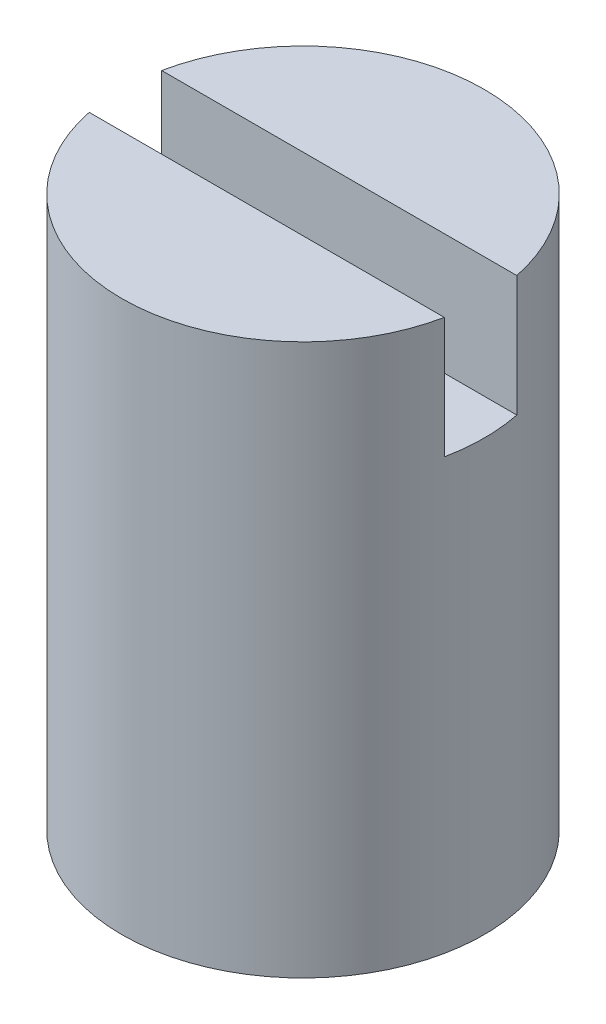
ISO-10303-21;
HEADER;
FILE_DESCRIPTION(('STEP AP214'),'2;1');
FILE_NAME('part.step','',(''),(''),'','','');
FILE_SCHEMA(('AUTOMOTIVE_DESIGN { 1 0 10303 214 1 1 1 1 }'));
ENDSEC;
DATA;
#1=APPLICATION_CONTEXT('core data for automotive mechanical design processes');
#2=APPLICATION_PROTOCOL_DEFINITION('international standard','automotive_design',2000,#1);
#3=PRODUCT_CONTEXT('',#1,'mechanical');
#4=PRODUCT('Part','Part','',(#3));
#5=PRODUCT_RELATED_PRODUCT_CATEGORY('part','',(#4));
#6=PRODUCT_DEFINITION_FORMATION('','',#4);
#7=PRODUCT_DEFINITION_CONTEXT('part definition',#1,'design');
#8=PRODUCT_DEFINITION('design','',#6,#7);
#9=PRODUCT_DEFINITION_SHAPE('','',#8);
#10=(LENGTH_UNIT() NAMED_UNIT(*) SI_UNIT(.MILLI.,.METRE.));
#11=(NAMED_UNIT(*) PLANE_ANGLE_UNIT() SI_UNIT($,.RADIAN.));
#12=(NAMED_UNIT(*) SI_UNIT($,.STERADIAN.) SOLID_ANGLE_UNIT());
#13=UNCERTAINTY_MEASURE_WITH_UNIT(LENGTH_MEASURE(1.E-05),#10,'distance_accuracy_value','');
#14=(GEOMETRIC_REPRESENTATION_CONTEXT(3) GLOBAL_UNCERTAINTY_ASSIGNED_CONTEXT((#13)) GLOBAL_UNIT_ASSIGNED_CONTEXT((#10,
#11,#12)) REPRESENTATION_CONTEXT('',''));
#15=CARTESIAN_POINT('',(0.,0.,0.));
#16=DIRECTION('',(0.,0.,1.));
#17=DIRECTION('',(1.,0.,0.));
#18=AXIS2_PLACEMENT_3D('',#15,#16,#17);
#19=CARTESIAN_POINT('',(0.,0.,0.));
#20=DIRECTION('',(0.,1.,0.));
#21=DIRECTION('',(0.,0.,1.));
#22=AXIS2_PLACEMENT_3D('',#19,#20,#21);
#23=PLANE('',#22);
#24=DIRECTION('',(-1.,0.,0.));
#25=VECTOR('',#24,1.);
#26=CARTESIAN_POINT('',(0.,0.,-0.952500000000001));
#27=LINE('',#26,#25);
#28=CARTESIAN_POINT('',(4.66627796000195,0.,-0.952500000000002));
#29=VERTEX_POINT('',#28);
#30=CARTESIAN_POINT('',(-4.66627796000195,0.,-0.9525));
#31=VERTEX_POINT('',#30);
#32=EDGE_CURVE('E87',#29,#31,#27,.T.);
#33=ORIENTED_EDGE('',*,*,#32,.F.);
#34=CARTESIAN_POINT('',(0.,0.,0.));
#35=DIRECTION('',(0.,1.,0.));
#36=DIRECTION('',(0.,0.,1.));
#37=AXIS2_PLACEMENT_3D('',#34,#35,#36);
#38=CIRCLE('',#37,4.7625);
#39=EDGE_CURVE('E98',#29,#31,#38,.T.);
#40=ORIENTED_EDGE('',*,*,#39,.T.);
#41=EDGE_LOOP('',(#33,#40));
#42=FACE_BOUND('',#41,.T.);
#43=ADVANCED_FACE('F39',(#42),#23,.T.);
#44=CARTESIAN_POINT('',(0.,-14.478,0.));
#45=DIRECTION('',(0.,1.,0.));
#46=DIRECTION('',(0.,0.,1.));
#47=AXIS2_PLACEMENT_3D('',#44,#45,#46);
#48=CYLINDRICAL_SURFACE('',#47,4.7625);
#49=DIRECTION('',(0.,1.,0.));
#50=VECTOR('',#49,1.);
#51=CARTESIAN_POINT('',(-4.66627796000195,-14.478,-0.9525));
#52=LINE('',#51,#50);
#53=CARTESIAN_POINT('',(-4.66627796000195,-3.175,-0.9525));
#54=VERTEX_POINT('',#53);
#55=EDGE_CURVE('E99',#31,#54,#52,.F.);
#56=ORIENTED_EDGE('',*,*,#55,.F.);
#57=ORIENTED_EDGE('',*,*,#39,.F.);
#58=DIRECTION('',(0.,1.,0.));
#59=VECTOR('',#58,1.);
#60=CARTESIAN_POINT('',(4.66627796000195,-14.478,-0.952500000000002));
#61=LINE('',#60,#59);
#62=CARTESIAN_POINT('',(4.66627796000195,-3.175,-0.952500000000002));
#63=VERTEX_POINT('',#62);
#64=EDGE_CURVE('E94',#63,#29,#61,.T.);
#65=ORIENTED_EDGE('',*,*,#64,.F.);
#66=CARTESIAN_POINT('',(0.,-3.175,0.));
#67=DIRECTION('',(0.,-1.,0.));
#68=DIRECTION('',(0.,0.,-1.));
#69=AXIS2_PLACEMENT_3D('',#66,#67,#68);
#70=CIRCLE('',#69,4.7625);
#71=CARTESIAN_POINT('',(4.66627796000195,-3.175,0.952499999999998));
#72=VERTEX_POINT('',#71);
#73=EDGE_CURVE('E43',#72,#63,#70,.F.);
#74=ORIENTED_EDGE('',*,*,#73,.F.);
#75=DIRECTION('',(0.,1.,0.));
#76=VECTOR('',#75,1.);
#77=CARTESIAN_POINT('',(4.66627796000195,-14.478,0.952499999999998));
#78=LINE('',#77,#76);
#79=CARTESIAN_POINT('',(4.66627796000195,0.,0.952499999999998));
#80=VERTEX_POINT('',#79);
#81=EDGE_CURVE('E81',#80,#72,#78,.F.);
#82=ORIENTED_EDGE('',*,*,#81,.F.);
#83=CARTESIAN_POINT('',(-4.66627796000195,0.,0.9525));
#84=VERTEX_POINT('',#83);
#85=EDGE_CURVE('E91',#84,#80,#38,.T.);
#86=ORIENTED_EDGE('',*,*,#85,.F.);
#87=DIRECTION('',(0.,1.,0.));
#88=VECTOR('',#87,1.);
#89=CARTESIAN_POINT('',(-4.66627796000195,-14.478,0.9525));
#90=LINE('',#89,#88);
#91=CARTESIAN_POINT('',(-4.66627796000195,-3.175,0.9525));
#92=VERTEX_POINT('',#91);
#93=EDGE_CURVE('E55',#92,#84,#90,.T.);
#94=ORIENTED_EDGE('',*,*,#93,.F.);
#95=EDGE_CURVE('E11',#54,#92,#70,.F.);
#96=ORIENTED_EDGE('',*,*,#95,.F.);
#97=EDGE_LOOP('',(#56,#57,#65,#74,#82,#86,#94,#96));
#98=FACE_BOUND('',#97,.T.);
#99=CARTESIAN_POINT('',(0.,-14.478,0.));
#100=DIRECTION('',(0.,1.,0.));
#101=DIRECTION('',(0.,0.,1.));
#102=AXIS2_PLACEMENT_3D('',#99,#100,#101);
#103=CIRCLE('',#102,4.7625);
#104=CARTESIAN_POINT('',(0.,-14.478,4.7625));
#105=VERTEX_POINT('',#104);
#106=EDGE_CURVE('E88',#105,#105,#103,.T.);
#107=ORIENTED_EDGE('',*,*,#106,.T.);
#108=EDGE_LOOP('',(#107));
#109=FACE_BOUND('',#108,.T.);
#110=ADVANCED_FACE('F41',(#98,#109),#48,.T.);
#111=CARTESIAN_POINT('',(0.,-14.478,0.));
#112=DIRECTION('',(0.,1.,0.));
#113=DIRECTION('',(0.,0.,1.));
#114=AXIS2_PLACEMENT_3D('',#111,#112,#113);
#115=PLANE('',#114);
#116=CARTESIAN_POINT('',(0.,-14.478,0.));
#117=DIRECTION('',(0.,-1.,0.));
#118=DIRECTION('',(0.,0.,-1.));
#119=AXIS2_PLACEMENT_3D('',#116,#117,#118);
#120=CIRCLE('',#119,1.999996);
#121=CARTESIAN_POINT('',(0.,-14.478,-1.999996));
#122=VERTEX_POINT('',#121);
#123=EDGE_CURVE('E128',#122,#122,#120,.T.);
#124=ORIENTED_EDGE('',*,*,#123,.F.);
#125=EDGE_LOOP('',(#124));
#126=FACE_BOUND('',#125,.T.);
#127=ORIENTED_EDGE('',*,*,#106,.F.);
#128=EDGE_LOOP('',(#127));
#129=FACE_BOUND('',#128,.T.);
#130=ADVANCED_FACE('F144',(#126,#129),#115,.F.);
#131=DIRECTION('',(1.,0.,0.));
#132=VECTOR('',#131,1.);
#133=CARTESIAN_POINT('',(0.,0.,0.952499999999999));
#134=LINE('',#133,#132);
#135=EDGE_CURVE('E78',#84,#80,#134,.T.);
#136=ORIENTED_EDGE('',*,*,#135,.F.);
#137=ORIENTED_EDGE('',*,*,#85,.T.);
#138=EDGE_LOOP('',(#136,#137));
#139=FACE_BOUND('',#138,.T.);
#140=ADVANCED_FACE('F96',(#139),#23,.T.);
#141=CARTESIAN_POINT('',(4.7625,-3.175,-0.952500000000002));
#142=DIRECTION('',(0.,0.,-1.));
#143=DIRECTION('',(-1.,0.,0.));
#144=AXIS2_PLACEMENT_3D('',#141,#142,#143);
#145=PLANE('',#144);
#146=ORIENTED_EDGE('',*,*,#55,.T.);
#147=DIRECTION('',(-1.,0.,0.));
#148=VECTOR('',#147,1.);
#149=CARTESIAN_POINT('',(4.7625,-3.175,-0.952500000000002));
#150=LINE('',#149,#148);
#151=EDGE_CURVE('E114',#63,#54,#150,.T.);
#152=ORIENTED_EDGE('',*,*,#151,.F.);
#153=ORIENTED_EDGE('',*,*,#64,.T.);
#154=ORIENTED_EDGE('',*,*,#32,.T.);
#155=EDGE_LOOP('',(#146,#152,#153,#154));
#156=FACE_BOUND('',#155,.T.);
#157=ADVANCED_FACE('F116',(#156),#145,.F.);
#158=CARTESIAN_POINT('',(4.7625,-3.175,0.952499999999998));
#159=DIRECTION('',(0.,0.,1.));
#160=DIRECTION('',(1.,0.,0.));
#161=AXIS2_PLACEMENT_3D('',#158,#159,#160);
#162=PLANE('',#161);
#163=ORIENTED_EDGE('',*,*,#81,.T.);
#164=DIRECTION('',(1.,0.,0.));
#165=VECTOR('',#164,1.);
#166=CARTESIAN_POINT('',(4.7625,-3.175,0.952499999999998));
#167=LINE('',#166,#165);
#168=EDGE_CURVE('E115',#92,#72,#167,.T.);
#169=ORIENTED_EDGE('',*,*,#168,.F.);
#170=ORIENTED_EDGE('',*,*,#93,.T.);
#171=ORIENTED_EDGE('',*,*,#135,.T.);
#172=EDGE_LOOP('',(#163,#169,#170,#171));
#173=FACE_BOUND('',#172,.T.);
#174=ADVANCED_FACE('F80',(#173),#162,.F.);
#175=CARTESIAN_POINT('',(0.,-3.175,0.));
#176=DIRECTION('',(0.,-1.,0.));
#177=DIRECTION('',(0.,0.,-1.));
#178=AXIS2_PLACEMENT_3D('',#175,#176,#177);
#179=PLANE('',#178);
#180=ORIENTED_EDGE('',*,*,#151,.T.);
#181=ORIENTED_EDGE('',*,*,#95,.T.);
#182=ORIENTED_EDGE('',*,*,#168,.T.);
#183=ORIENTED_EDGE('',*,*,#73,.T.);
#184=EDGE_LOOP('',(#180,#181,#182,#183));
#185=FACE_BOUND('',#184,.T.);
#186=ADVANCED_FACE('F113',(#185),#179,.F.);
#187=CARTESIAN_POINT('',(0.,-9.478,0.));
#188=DIRECTION('',(0.,-1.,0.));
#189=DIRECTION('',(0.,0.,-1.));
#190=AXIS2_PLACEMENT_3D('',#187,#188,#189);
#191=CYLINDRICAL_SURFACE('',#190,1.999996);
#192=CARTESIAN_POINT('',(0.,-9.478,0.));
#193=DIRECTION('',(0.,-1.,0.));
#194=DIRECTION('',(0.,0.,-1.));
#195=AXIS2_PLACEMENT_3D('',#192,#193,#194);
#196=CIRCLE('',#195,1.999996);
#197=CARTESIAN_POINT('',(0.,-9.478,-1.999996));
#198=VERTEX_POINT('',#197);
#199=EDGE_CURVE('E127',#198,#198,#196,.T.);
#200=ORIENTED_EDGE('',*,*,#199,.F.);
#201=EDGE_LOOP('',(#200));
#202=FACE_BOUND('',#201,.T.);
#203=ORIENTED_EDGE('',*,*,#123,.T.);
#204=EDGE_LOOP('',(#203));
#205=FACE_BOUND('',#204,.T.);
#206=ADVANCED_FACE('F138',(#202,#205),#191,.F.);
#207=CARTESIAN_POINT('',(0.,-9.478,0.));
#208=DIRECTION('',(0.,-1.,0.));
#209=DIRECTION('',(0.,0.,-1.));
#210=AXIS2_PLACEMENT_3D('',#207,#208,#209);
#211=PLANE('',#210);
#212=ORIENTED_EDGE('',*,*,#199,.T.);
#213=EDGE_LOOP('',(#212));
#214=FACE_BOUND('',#213,.T.);
#215=ADVANCED_FACE('F136',(#214),#211,.T.);
#216=CLOSED_SHELL('',(#43,#110,#130,#140,#157,#174,#186,#206,#215));
#217=MANIFOLD_SOLID_BREP('B2',#216);
#218=ADVANCED_BREP_SHAPE_REPRESENTATION('',(#18,#217),#14);
#219=SHAPE_DEFINITION_REPRESENTATION(#9,#218);
ENDSEC;
END-ISO-10303-21;
